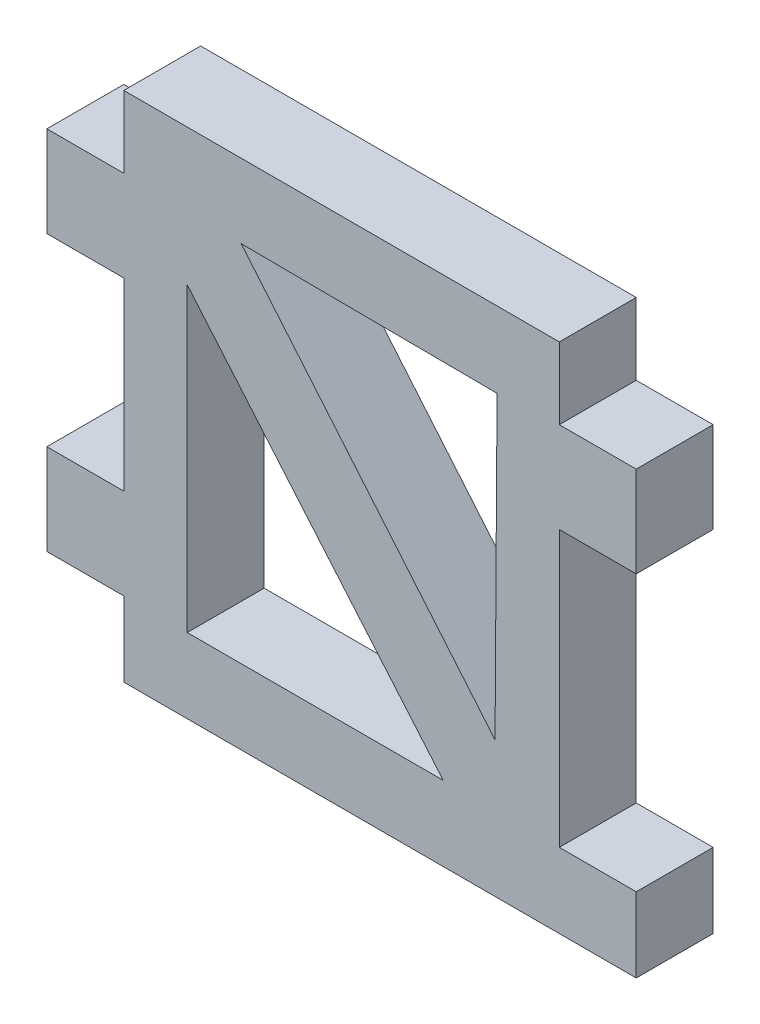
ISO-10303-21;
HEADER;
FILE_DESCRIPTION(('STEP AP214'),'2;1');
FILE_NAME('part.step','',(''),(''),'','','');
FILE_SCHEMA(('AUTOMOTIVE_DESIGN { 1 0 10303 214 1 1 1 1 }'));
ENDSEC;
DATA;
#1=APPLICATION_CONTEXT('core data for automotive mechanical design processes');
#2=APPLICATION_PROTOCOL_DEFINITION('international standard','automotive_design',2000,#1);
#3=PRODUCT_CONTEXT('',#1,'mechanical');
#4=PRODUCT('Part','Part','',(#3));
#5=PRODUCT_RELATED_PRODUCT_CATEGORY('part','',(#4));
#6=PRODUCT_DEFINITION_FORMATION('','',#4);
#7=PRODUCT_DEFINITION_CONTEXT('part definition',#1,'design');
#8=PRODUCT_DEFINITION('design','',#6,#7);
#9=PRODUCT_DEFINITION_SHAPE('','',#8);
#10=(LENGTH_UNIT() NAMED_UNIT(*) SI_UNIT(.MILLI.,.METRE.));
#11=(NAMED_UNIT(*) PLANE_ANGLE_UNIT() SI_UNIT($,.RADIAN.));
#12=(NAMED_UNIT(*) SI_UNIT($,.STERADIAN.) SOLID_ANGLE_UNIT());
#13=UNCERTAINTY_MEASURE_WITH_UNIT(LENGTH_MEASURE(1.E-05),#10,'distance_accuracy_value','');
#14=(GEOMETRIC_REPRESENTATION_CONTEXT(3) GLOBAL_UNCERTAINTY_ASSIGNED_CONTEXT((#13)) GLOBAL_UNIT_ASSIGNED_CONTEXT((#10,
#11,#12)) REPRESENTATION_CONTEXT('',''));
#15=CARTESIAN_POINT('',(0.,0.,0.));
#16=DIRECTION('',(0.,0.,1.));
#17=DIRECTION('',(1.,0.,0.));
#18=AXIS2_PLACEMENT_3D('',#15,#16,#17);
#19=CARTESIAN_POINT('',(0.,0.,10.));
#20=DIRECTION('',(0.,0.,1.));
#21=DIRECTION('',(1.,0.,0.));
#22=AXIS2_PLACEMENT_3D('',#19,#20,#21);
#23=PLANE('',#22);
#24=DIRECTION('',(0.,-1.,0.));
#25=VECTOR('',#24,1.);
#26=CARTESIAN_POINT('',(-28.32,23.992,10.));
#27=LINE('',#26,#25);
#28=CARTESIAN_POINT('',(-28.32,33.32,10.));
#29=VERTEX_POINT('',#28);
#30=CARTESIAN_POINT('',(-28.32,23.992,10.));
#31=VERTEX_POINT('',#30);
#32=EDGE_CURVE('E253',#29,#31,#27,.T.);
#33=ORIENTED_EDGE('',*,*,#32,.T.);
#34=DIRECTION('',(-1.,0.,0.));
#35=VECTOR('',#34,1.);
#36=CARTESIAN_POINT('',(-28.32,23.992,10.));
#37=LINE('',#36,#35);
#38=CARTESIAN_POINT('',(-38.32,23.992,10.));
#39=VERTEX_POINT('',#38);
#40=EDGE_CURVE('E256',#31,#39,#37,.T.);
#41=ORIENTED_EDGE('',*,*,#40,.T.);
#42=DIRECTION('',(0.,-1.,0.));
#43=VECTOR('',#42,1.);
#44=CARTESIAN_POINT('',(-38.32,23.992,10.));
#45=LINE('',#44,#43);
#46=CARTESIAN_POINT('',(-38.32,12.192,10.));
#47=VERTEX_POINT('',#46);
#48=EDGE_CURVE('E259',#39,#47,#45,.T.);
#49=ORIENTED_EDGE('',*,*,#48,.T.);
#50=DIRECTION('',(1.,0.,0.));
#51=VECTOR('',#50,1.);
#52=CARTESIAN_POINT('',(-38.32,12.192,10.));
#53=LINE('',#52,#51);
#54=CARTESIAN_POINT('',(-28.32,12.192,10.));
#55=VERTEX_POINT('',#54);
#56=EDGE_CURVE('E261',#47,#55,#53,.T.);
#57=ORIENTED_EDGE('',*,*,#56,.T.);
#58=DIRECTION('',(0.,-1.,0.));
#59=VECTOR('',#58,1.);
#60=CARTESIAN_POINT('',(-28.32,-11.808,10.));
#61=LINE('',#60,#59);
#62=CARTESIAN_POINT('',(-28.32,-11.808,10.));
#63=VERTEX_POINT('',#62);
#64=EDGE_CURVE('E263',#55,#63,#61,.T.);
#65=ORIENTED_EDGE('',*,*,#64,.T.);
#66=DIRECTION('',(-1.,0.,0.));
#67=VECTOR('',#66,1.);
#68=CARTESIAN_POINT('',(-28.32,-11.808,10.));
#69=LINE('',#68,#67);
#70=CARTESIAN_POINT('',(-38.32,-11.808,10.));
#71=VERTEX_POINT('',#70);
#72=EDGE_CURVE('E265',#63,#71,#69,.T.);
#73=ORIENTED_EDGE('',*,*,#72,.T.);
#74=DIRECTION('',(0.,-1.,0.));
#75=VECTOR('',#74,1.);
#76=CARTESIAN_POINT('',(-38.32,-11.808,10.));
#77=LINE('',#76,#75);
#78=CARTESIAN_POINT('',(-38.32,-23.608,10.));
#79=VERTEX_POINT('',#78);
#80=EDGE_CURVE('E267',#71,#79,#77,.T.);
#81=ORIENTED_EDGE('',*,*,#80,.T.);
#82=DIRECTION('',(1.,0.,0.));
#83=VECTOR('',#82,1.);
#84=CARTESIAN_POINT('',(-38.32,-23.608,10.));
#85=LINE('',#84,#83);
#86=CARTESIAN_POINT('',(-28.32,-23.608,10.));
#87=VERTEX_POINT('',#86);
#88=EDGE_CURVE('E269',#79,#87,#85,.T.);
#89=ORIENTED_EDGE('',*,*,#88,.T.);
#90=DIRECTION('',(0.,-1.,0.));
#91=VECTOR('',#90,1.);
#92=CARTESIAN_POINT('',(-28.32,-33.32,10.));
#93=LINE('',#92,#91);
#94=CARTESIAN_POINT('',(-28.32,-33.32,10.));
#95=VERTEX_POINT('',#94);
#96=EDGE_CURVE('E271',#87,#95,#93,.T.);
#97=ORIENTED_EDGE('',*,*,#96,.T.);
#98=DIRECTION('',(1.,0.,0.));
#99=VECTOR('',#98,1.);
#100=CARTESIAN_POINT('',(28.32,-33.32,10.));
#101=LINE('',#100,#99);
#102=CARTESIAN_POINT('',(38.32,-33.32,10.));
#103=VERTEX_POINT('',#102);
#104=EDGE_CURVE('E273',#95,#103,#101,.T.);
#105=ORIENTED_EDGE('',*,*,#104,.T.);
#106=DIRECTION('',(0.,1.,0.));
#107=VECTOR('',#106,1.);
#108=CARTESIAN_POINT('',(38.32,-33.32,10.));
#109=LINE('',#108,#107);
#110=CARTESIAN_POINT('',(38.32,-23.608,10.));
#111=VERTEX_POINT('',#110);
#112=EDGE_CURVE('E275',#103,#111,#109,.T.);
#113=ORIENTED_EDGE('',*,*,#112,.T.);
#114=DIRECTION('',(-1.,0.,0.));
#115=VECTOR('',#114,1.);
#116=CARTESIAN_POINT('',(38.32,-23.608,10.));
#117=LINE('',#116,#115);
#118=CARTESIAN_POINT('',(28.32,-23.608,10.));
#119=VERTEX_POINT('',#118);
#120=EDGE_CURVE('E277',#111,#119,#117,.T.);
#121=ORIENTED_EDGE('',*,*,#120,.T.);
#122=DIRECTION('',(0.,1.,0.));
#123=VECTOR('',#122,1.);
#124=CARTESIAN_POINT('',(28.32,-23.608,10.));
#125=LINE('',#124,#123);
#126=CARTESIAN_POINT('',(28.32,12.192,10.));
#127=VERTEX_POINT('',#126);
#128=EDGE_CURVE('E279',#119,#127,#125,.T.);
#129=ORIENTED_EDGE('',*,*,#128,.T.);
#130=DIRECTION('',(1.,0.,0.));
#131=VECTOR('',#130,1.);
#132=CARTESIAN_POINT('',(28.32,12.192,10.));
#133=LINE('',#132,#131);
#134=CARTESIAN_POINT('',(38.32,12.192,10.));
#135=VERTEX_POINT('',#134);
#136=EDGE_CURVE('E281',#127,#135,#133,.T.);
#137=ORIENTED_EDGE('',*,*,#136,.T.);
#138=DIRECTION('',(0.,1.,0.));
#139=VECTOR('',#138,1.);
#140=CARTESIAN_POINT('',(38.32,12.192,10.));
#141=LINE('',#140,#139);
#142=CARTESIAN_POINT('',(38.32,23.992,10.));
#143=VERTEX_POINT('',#142);
#144=EDGE_CURVE('E283',#135,#143,#141,.T.);
#145=ORIENTED_EDGE('',*,*,#144,.T.);
#146=DIRECTION('',(-1.,0.,0.));
#147=VECTOR('',#146,1.);
#148=CARTESIAN_POINT('',(38.32,23.992,10.));
#149=LINE('',#148,#147);
#150=CARTESIAN_POINT('',(28.32,23.992,10.));
#151=VERTEX_POINT('',#150);
#152=EDGE_CURVE('E285',#143,#151,#149,.T.);
#153=ORIENTED_EDGE('',*,*,#152,.T.);
#154=DIRECTION('',(0.,1.,0.));
#155=VECTOR('',#154,1.);
#156=CARTESIAN_POINT('',(28.32,23.992,10.));
#157=LINE('',#156,#155);
#158=CARTESIAN_POINT('',(28.32,33.32,10.));
#159=VERTEX_POINT('',#158);
#160=EDGE_CURVE('E287',#151,#159,#157,.T.);
#161=ORIENTED_EDGE('',*,*,#160,.T.);
#162=DIRECTION('',(-1.,0.,0.));
#163=VECTOR('',#162,1.);
#164=CARTESIAN_POINT('',(28.32,33.32,10.));
#165=LINE('',#164,#163);
#166=EDGE_CURVE('E289',#159,#29,#165,.T.);
#167=ORIENTED_EDGE('',*,*,#166,.T.);
#168=EDGE_LOOP('',(#33,#41,#49,#57,#65,#73,#81,#89,#97,#105,#113,#121,#129,#137,#145,#153,#161,#167));
#169=FACE_BOUND('',#168,.T.);
#170=DIRECTION('',(-0.647621867593382,0.761961886589388,0.));
#171=VECTOR('',#170,1.);
#172=CARTESIAN_POINT('',(-20.0653829531813,15.54908888197,10.));
#173=LINE('',#172,#171);
#174=CARTESIAN_POINT('',(13.2157922310141,-23.608,10.));
#175=VERTEX_POINT('',#174);
#176=CARTESIAN_POINT('',(-20.0653829531813,15.54908888197,10.));
#177=VERTEX_POINT('',#176);
#178=EDGE_CURVE('E231',#175,#177,#173,.T.);
#179=ORIENTED_EDGE('',*,*,#178,.F.);
#180=DIRECTION('',(1.,0.,0.));
#181=VECTOR('',#180,1.);
#182=CARTESIAN_POINT('',(13.2157922310141,-23.608,10.));
#183=LINE('',#182,#181);
#184=CARTESIAN_POINT('',(-20.0653829531813,-23.608,10.));
#185=VERTEX_POINT('',#184);
#186=EDGE_CURVE('E229',#185,#175,#183,.T.);
#187=ORIENTED_EDGE('',*,*,#186,.F.);
#188=DIRECTION('',(0.,-1.,0.));
#189=VECTOR('',#188,1.);
#190=CARTESIAN_POINT('',(-20.0653829531813,-23.608,10.));
#191=LINE('',#190,#189);
#192=EDGE_CURVE('E235',#177,#185,#191,.T.);
#193=ORIENTED_EDGE('',*,*,#192,.F.);
#194=EDGE_LOOP('',(#179,#187,#193));
#195=FACE_BOUND('',#194,.T.);
#196=DIRECTION('',(0.642544730945267,-0.76624817698607,0.));
#197=VECTOR('',#196,1.);
#198=CARTESIAN_POINT('',(19.9616244035888,-15.6820696748628,10.));
#199=LINE('',#198,#197);
#200=CARTESIAN_POINT('',(-13.0586376109387,23.6952909254054,10.));
#201=VERTEX_POINT('',#200);
#202=CARTESIAN_POINT('',(19.9616244035888,-15.6820696748628,10.));
#203=VERTEX_POINT('',#202);
#204=EDGE_CURVE('E210',#201,#203,#199,.T.);
#205=ORIENTED_EDGE('',*,*,#204,.F.);
#206=DIRECTION('',(-0.999977925199046,0.00664448001061593,0.));
#207=VECTOR('',#206,1.);
#208=CARTESIAN_POINT('',(-13.0586376109387,23.6952909254054,10.));
#209=LINE('',#208,#207);
#210=CARTESIAN_POINT('',(20.221802897939,23.4741548221642,10.));
#211=VERTEX_POINT('',#210);
#212=EDGE_CURVE('E202',#211,#201,#209,.T.);
#213=ORIENTED_EDGE('',*,*,#212,.F.);
#214=DIRECTION('',(0.00664448001061655,0.999977925199046,0.));
#215=VECTOR('',#214,1.);
#216=CARTESIAN_POINT('',(20.221802897939,23.4741548221642,10.));
#217=LINE('',#216,#215);
#218=EDGE_CURVE('E219',#203,#211,#217,.T.);
#219=ORIENTED_EDGE('',*,*,#218,.F.);
#220=EDGE_LOOP('',(#205,#213,#219));
#221=FACE_BOUND('',#220,.T.);
#222=ADVANCED_FACE('F41',(#169,#195,#221),#23,.T.);
#223=CARTESIAN_POINT('',(0.,0.,0.));
#224=DIRECTION('',(0.,0.,1.));
#225=DIRECTION('',(1.,0.,0.));
#226=AXIS2_PLACEMENT_3D('',#223,#224,#225);
#227=PLANE('',#226);
#228=DIRECTION('',(1.,0.,0.));
#229=VECTOR('',#228,1.);
#230=CARTESIAN_POINT('',(13.2157922310141,-23.608,0.));
#231=LINE('',#230,#229);
#232=CARTESIAN_POINT('',(-20.0653829531813,-23.608,0.));
#233=VERTEX_POINT('',#232);
#234=CARTESIAN_POINT('',(13.2157922310141,-23.608,0.));
#235=VERTEX_POINT('',#234);
#236=EDGE_CURVE('E217',#233,#235,#231,.T.);
#237=ORIENTED_EDGE('',*,*,#236,.T.);
#238=DIRECTION('',(-0.647621867593382,0.761961886589388,0.));
#239=VECTOR('',#238,1.);
#240=CARTESIAN_POINT('',(-20.0653829531813,15.54908888197,0.));
#241=LINE('',#240,#239);
#242=CARTESIAN_POINT('',(-20.0653829531813,15.54908888197,0.));
#243=VERTEX_POINT('',#242);
#244=EDGE_CURVE('E240',#235,#243,#241,.T.);
#245=ORIENTED_EDGE('',*,*,#244,.T.);
#246=DIRECTION('',(0.,-1.,0.));
#247=VECTOR('',#246,1.);
#248=CARTESIAN_POINT('',(-20.0653829531813,-23.608,0.));
#249=LINE('',#248,#247);
#250=EDGE_CURVE('E232',#243,#233,#249,.T.);
#251=ORIENTED_EDGE('',*,*,#250,.T.);
#252=EDGE_LOOP('',(#237,#245,#251));
#253=FACE_BOUND('',#252,.T.);
#254=DIRECTION('',(0.,-1.,0.));
#255=VECTOR('',#254,1.);
#256=CARTESIAN_POINT('',(-28.32,23.992,0.));
#257=LINE('',#256,#255);
#258=CARTESIAN_POINT('',(-28.32,33.32,0.));
#259=VERTEX_POINT('',#258);
#260=CARTESIAN_POINT('',(-28.32,23.992,0.));
#261=VERTEX_POINT('',#260);
#262=EDGE_CURVE('E252',#259,#261,#257,.T.);
#263=ORIENTED_EDGE('',*,*,#262,.F.);
#264=DIRECTION('',(-1.,0.,0.));
#265=VECTOR('',#264,1.);
#266=CARTESIAN_POINT('',(28.32,33.32,0.));
#267=LINE('',#266,#265);
#268=CARTESIAN_POINT('',(28.32,33.32,0.));
#269=VERTEX_POINT('',#268);
#270=EDGE_CURVE('E257',#269,#259,#267,.T.);
#271=ORIENTED_EDGE('',*,*,#270,.F.);
#272=DIRECTION('',(0.,1.,0.));
#273=VECTOR('',#272,1.);
#274=CARTESIAN_POINT('',(28.32,23.992,0.));
#275=LINE('',#274,#273);
#276=CARTESIAN_POINT('',(28.32,23.992,0.));
#277=VERTEX_POINT('',#276);
#278=EDGE_CURVE('E325',#277,#269,#275,.T.);
#279=ORIENTED_EDGE('',*,*,#278,.F.);
#280=DIRECTION('',(-1.,0.,0.));
#281=VECTOR('',#280,1.);
#282=CARTESIAN_POINT('',(38.32,23.992,0.));
#283=LINE('',#282,#281);
#284=CARTESIAN_POINT('',(38.32,23.992,0.));
#285=VERTEX_POINT('',#284);
#286=EDGE_CURVE('E323',#285,#277,#283,.T.);
#287=ORIENTED_EDGE('',*,*,#286,.F.);
#288=DIRECTION('',(0.,1.,0.));
#289=VECTOR('',#288,1.);
#290=CARTESIAN_POINT('',(38.32,12.192,0.));
#291=LINE('',#290,#289);
#292=CARTESIAN_POINT('',(38.32,12.192,0.));
#293=VERTEX_POINT('',#292);
#294=EDGE_CURVE('E321',#293,#285,#291,.T.);
#295=ORIENTED_EDGE('',*,*,#294,.F.);
#296=DIRECTION('',(1.,0.,0.));
#297=VECTOR('',#296,1.);
#298=CARTESIAN_POINT('',(28.32,12.192,0.));
#299=LINE('',#298,#297);
#300=CARTESIAN_POINT('',(28.32,12.192,0.));
#301=VERTEX_POINT('',#300);
#302=EDGE_CURVE('E319',#301,#293,#299,.T.);
#303=ORIENTED_EDGE('',*,*,#302,.F.);
#304=DIRECTION('',(0.,1.,0.));
#305=VECTOR('',#304,1.);
#306=CARTESIAN_POINT('',(28.32,-23.608,0.));
#307=LINE('',#306,#305);
#308=CARTESIAN_POINT('',(28.32,-23.608,0.));
#309=VERTEX_POINT('',#308);
#310=EDGE_CURVE('E317',#309,#301,#307,.T.);
#311=ORIENTED_EDGE('',*,*,#310,.F.);
#312=DIRECTION('',(-1.,0.,0.));
#313=VECTOR('',#312,1.);
#314=CARTESIAN_POINT('',(38.32,-23.608,0.));
#315=LINE('',#314,#313);
#316=CARTESIAN_POINT('',(38.32,-23.608,0.));
#317=VERTEX_POINT('',#316);
#318=EDGE_CURVE('E315',#317,#309,#315,.T.);
#319=ORIENTED_EDGE('',*,*,#318,.F.);
#320=DIRECTION('',(0.,1.,0.));
#321=VECTOR('',#320,1.);
#322=CARTESIAN_POINT('',(38.32,-33.32,0.));
#323=LINE('',#322,#321);
#324=CARTESIAN_POINT('',(38.32,-33.32,0.));
#325=VERTEX_POINT('',#324);
#326=EDGE_CURVE('E313',#325,#317,#323,.T.);
#327=ORIENTED_EDGE('',*,*,#326,.F.);
#328=DIRECTION('',(1.,0.,0.));
#329=VECTOR('',#328,1.);
#330=CARTESIAN_POINT('',(28.32,-33.32,0.));
#331=LINE('',#330,#329);
#332=CARTESIAN_POINT('',(-28.32,-33.32,0.));
#333=VERTEX_POINT('',#332);
#334=EDGE_CURVE('E311',#333,#325,#331,.T.);
#335=ORIENTED_EDGE('',*,*,#334,.F.);
#336=DIRECTION('',(0.,-1.,0.));
#337=VECTOR('',#336,1.);
#338=CARTESIAN_POINT('',(-28.32,-33.32,0.));
#339=LINE('',#338,#337);
#340=CARTESIAN_POINT('',(-28.32,-23.608,0.));
#341=VERTEX_POINT('',#340);
#342=EDGE_CURVE('E308',#341,#333,#339,.T.);
#343=ORIENTED_EDGE('',*,*,#342,.F.);
#344=DIRECTION('',(1.,0.,0.));
#345=VECTOR('',#344,1.);
#346=CARTESIAN_POINT('',(-38.32,-23.608,0.));
#347=LINE('',#346,#345);
#348=CARTESIAN_POINT('',(-38.32,-23.608,0.));
#349=VERTEX_POINT('',#348);
#350=EDGE_CURVE('E306',#349,#341,#347,.T.);
#351=ORIENTED_EDGE('',*,*,#350,.F.);
#352=DIRECTION('',(0.,-1.,0.));
#353=VECTOR('',#352,1.);
#354=CARTESIAN_POINT('',(-38.32,-11.808,0.));
#355=LINE('',#354,#353);
#356=CARTESIAN_POINT('',(-38.32,-11.808,0.));
#357=VERTEX_POINT('',#356);
#358=EDGE_CURVE('E304',#357,#349,#355,.T.);
#359=ORIENTED_EDGE('',*,*,#358,.F.);
#360=DIRECTION('',(-1.,0.,0.));
#361=VECTOR('',#360,1.);
#362=CARTESIAN_POINT('',(-28.32,-11.808,0.));
#363=LINE('',#362,#361);
#364=CARTESIAN_POINT('',(-28.32,-11.808,0.));
#365=VERTEX_POINT('',#364);
#366=EDGE_CURVE('E302',#365,#357,#363,.T.);
#367=ORIENTED_EDGE('',*,*,#366,.F.);
#368=DIRECTION('',(0.,-1.,0.));
#369=VECTOR('',#368,1.);
#370=CARTESIAN_POINT('',(-28.32,-11.808,0.));
#371=LINE('',#370,#369);
#372=CARTESIAN_POINT('',(-28.32,12.192,0.));
#373=VERTEX_POINT('',#372);
#374=EDGE_CURVE('E300',#373,#365,#371,.T.);
#375=ORIENTED_EDGE('',*,*,#374,.F.);
#376=DIRECTION('',(1.,0.,0.));
#377=VECTOR('',#376,1.);
#378=CARTESIAN_POINT('',(-38.32,12.192,0.));
#379=LINE('',#378,#377);
#380=CARTESIAN_POINT('',(-38.32,12.192,0.));
#381=VERTEX_POINT('',#380);
#382=EDGE_CURVE('E298',#381,#373,#379,.T.);
#383=ORIENTED_EDGE('',*,*,#382,.F.);
#384=DIRECTION('',(0.,-1.,0.));
#385=VECTOR('',#384,1.);
#386=CARTESIAN_POINT('',(-38.32,23.992,0.));
#387=LINE('',#386,#385);
#388=CARTESIAN_POINT('',(-38.32,23.992,0.));
#389=VERTEX_POINT('',#388);
#390=EDGE_CURVE('E296',#389,#381,#387,.T.);
#391=ORIENTED_EDGE('',*,*,#390,.F.);
#392=DIRECTION('',(-1.,0.,0.));
#393=VECTOR('',#392,1.);
#394=CARTESIAN_POINT('',(-28.32,23.992,0.));
#395=LINE('',#394,#393);
#396=EDGE_CURVE('E294',#261,#389,#395,.T.);
#397=ORIENTED_EDGE('',*,*,#396,.F.);
#398=EDGE_LOOP('',(#263,#271,#279,#287,#295,#303,#311,#319,#327,#335,#343,#351,#359,#367,#375,
#383,#391,#397));
#399=FACE_BOUND('',#398,.T.);
#400=DIRECTION('',(-0.999977925199046,0.00664448001061593,0.));
#401=VECTOR('',#400,1.);
#402=CARTESIAN_POINT('',(-13.0586376109387,23.6952909254054,0.));
#403=LINE('',#402,#401);
#404=CARTESIAN_POINT('',(20.221802897939,23.4741548221642,0.));
#405=VERTEX_POINT('',#404);
#406=CARTESIAN_POINT('',(-13.0586376109387,23.6952909254054,0.));
#407=VERTEX_POINT('',#406);
#408=EDGE_CURVE('E64',#405,#407,#403,.T.);
#409=ORIENTED_EDGE('',*,*,#408,.T.);
#410=DIRECTION('',(0.642544730945267,-0.76624817698607,0.));
#411=VECTOR('',#410,1.);
#412=CARTESIAN_POINT('',(19.9616244035888,-15.6820696748628,0.));
#413=LINE('',#412,#411);
#414=CARTESIAN_POINT('',(19.9616244035888,-15.6820696748628,0.));
#415=VERTEX_POINT('',#414);
#416=EDGE_CURVE('E216',#407,#415,#413,.T.);
#417=ORIENTED_EDGE('',*,*,#416,.T.);
#418=DIRECTION('',(0.00664448001061655,0.999977925199046,0.));
#419=VECTOR('',#418,1.);
#420=CARTESIAN_POINT('',(20.221802897939,23.4741548221642,0.));
#421=LINE('',#420,#419);
#422=EDGE_CURVE('E211',#415,#405,#421,.T.);
#423=ORIENTED_EDGE('',*,*,#422,.T.);
#424=EDGE_LOOP('',(#409,#417,#423));
#425=FACE_BOUND('',#424,.T.);
#426=ADVANCED_FACE('F385',(#253,#399,#425),#227,.F.);
#427=CARTESIAN_POINT('',(-28.32,23.992,10.));
#428=DIRECTION('',(1.,0.,0.));
#429=DIRECTION('',(0.,0.,-1.));
#430=AXIS2_PLACEMENT_3D('',#427,#428,#429);
#431=PLANE('',#430);
#432=ORIENTED_EDGE('',*,*,#262,.T.);
#433=DIRECTION('',(0.,0.,-1.));
#434=VECTOR('',#433,1.);
#435=CARTESIAN_POINT('',(-28.32,23.992,10.));
#436=LINE('',#435,#434);
#437=EDGE_CURVE('E11',#31,#261,#436,.T.);
#438=ORIENTED_EDGE('',*,*,#437,.F.);
#439=ORIENTED_EDGE('',*,*,#32,.F.);
#440=DIRECTION('',(0.,0.,-1.));
#441=VECTOR('',#440,1.);
#442=CARTESIAN_POINT('',(-28.32,33.32,10.));
#443=LINE('',#442,#441);
#444=EDGE_CURVE('E291',#29,#259,#443,.T.);
#445=ORIENTED_EDGE('',*,*,#444,.T.);
#446=EDGE_LOOP('',(#432,#438,#439,#445));
#447=FACE_BOUND('',#446,.T.);
#448=ADVANCED_FACE('F43',(#447),#431,.F.);
#449=CARTESIAN_POINT('',(-28.32,23.992,10.));
#450=DIRECTION('',(0.,-1.,0.));
#451=DIRECTION('',(0.,0.,-1.));
#452=AXIS2_PLACEMENT_3D('',#449,#450,#451);
#453=PLANE('',#452);
#454=ORIENTED_EDGE('',*,*,#396,.T.);
#455=DIRECTION('',(0.,0.,-1.));
#456=VECTOR('',#455,1.);
#457=CARTESIAN_POINT('',(-38.32,23.992,10.));
#458=LINE('',#457,#456);
#459=EDGE_CURVE('E49',#39,#389,#458,.T.);
#460=ORIENTED_EDGE('',*,*,#459,.F.);
#461=ORIENTED_EDGE('',*,*,#40,.F.);
#462=ORIENTED_EDGE('',*,*,#437,.T.);
#463=EDGE_LOOP('',(#454,#460,#461,#462));
#464=FACE_BOUND('',#463,.T.);
#465=ADVANCED_FACE('F403',(#464),#453,.F.);
#466=CARTESIAN_POINT('',(-38.32,23.992,10.));
#467=DIRECTION('',(1.,0.,0.));
#468=DIRECTION('',(0.,1.,0.));
#469=AXIS2_PLACEMENT_3D('',#466,#467,#468);
#470=PLANE('',#469);
#471=ORIENTED_EDGE('',*,*,#390,.T.);
#472=DIRECTION('',(0.,0.,-1.));
#473=VECTOR('',#472,1.);
#474=CARTESIAN_POINT('',(-38.32,12.192,10.));
#475=LINE('',#474,#473);
#476=EDGE_CURVE('E372',#47,#381,#475,.T.);
#477=ORIENTED_EDGE('',*,*,#476,.F.);
#478=ORIENTED_EDGE('',*,*,#48,.F.);
#479=ORIENTED_EDGE('',*,*,#459,.T.);
#480=EDGE_LOOP('',(#471,#477,#478,#479));
#481=FACE_BOUND('',#480,.T.);
#482=ADVANCED_FACE('F379',(#481),#470,.F.);
#483=CARTESIAN_POINT('',(-38.32,12.192,10.));
#484=DIRECTION('',(0.,1.,0.));
#485=DIRECTION('',(-1.,0.,0.));
#486=AXIS2_PLACEMENT_3D('',#483,#484,#485);
#487=PLANE('',#486);
#488=ORIENTED_EDGE('',*,*,#382,.T.);
#489=DIRECTION('',(0.,0.,-1.));
#490=VECTOR('',#489,1.);
#491=CARTESIAN_POINT('',(-28.32,12.192,10.));
#492=LINE('',#491,#490);
#493=EDGE_CURVE('E369',#55,#373,#492,.T.);
#494=ORIENTED_EDGE('',*,*,#493,.F.);
#495=ORIENTED_EDGE('',*,*,#56,.F.);
#496=ORIENTED_EDGE('',*,*,#476,.T.);
#497=EDGE_LOOP('',(#488,#494,#495,#496));
#498=FACE_BOUND('',#497,.T.);
#499=ADVANCED_FACE('F391',(#498),#487,.F.);
#500=CARTESIAN_POINT('',(-28.32,-11.808,10.));
#501=DIRECTION('',(1.,0.,0.));
#502=DIRECTION('',(0.,1.,0.));
#503=AXIS2_PLACEMENT_3D('',#500,#501,#502);
#504=PLANE('',#503);
#505=ORIENTED_EDGE('',*,*,#374,.T.);
#506=DIRECTION('',(0.,0.,-1.));
#507=VECTOR('',#506,1.);
#508=CARTESIAN_POINT('',(-28.32,-11.808,10.));
#509=LINE('',#508,#507);
#510=EDGE_CURVE('E366',#63,#365,#509,.T.);
#511=ORIENTED_EDGE('',*,*,#510,.F.);
#512=ORIENTED_EDGE('',*,*,#64,.F.);
#513=ORIENTED_EDGE('',*,*,#493,.T.);
#514=EDGE_LOOP('',(#505,#511,#512,#513));
#515=FACE_BOUND('',#514,.T.);
#516=ADVANCED_FACE('F395',(#515),#504,.F.);
#517=CARTESIAN_POINT('',(-28.32,-11.808,10.));
#518=DIRECTION('',(0.,-1.,0.));
#519=DIRECTION('',(0.,0.,-1.));
#520=AXIS2_PLACEMENT_3D('',#517,#518,#519);
#521=PLANE('',#520);
#522=ORIENTED_EDGE('',*,*,#366,.T.);
#523=DIRECTION('',(0.,0.,-1.));
#524=VECTOR('',#523,1.);
#525=CARTESIAN_POINT('',(-38.32,-11.808,10.));
#526=LINE('',#525,#524);
#527=EDGE_CURVE('E363',#71,#357,#526,.T.);
#528=ORIENTED_EDGE('',*,*,#527,.F.);
#529=ORIENTED_EDGE('',*,*,#72,.F.);
#530=ORIENTED_EDGE('',*,*,#510,.T.);
#531=EDGE_LOOP('',(#522,#528,#529,#530));
#532=FACE_BOUND('',#531,.T.);
#533=ADVANCED_FACE('F465',(#532),#521,.F.);
#534=CARTESIAN_POINT('',(-38.32,-11.808,10.));
#535=DIRECTION('',(1.,0.,0.));
#536=DIRECTION('',(0.,1.,0.));
#537=AXIS2_PLACEMENT_3D('',#534,#535,#536);
#538=PLANE('',#537);
#539=ORIENTED_EDGE('',*,*,#358,.T.);
#540=DIRECTION('',(0.,0.,-1.));
#541=VECTOR('',#540,1.);
#542=CARTESIAN_POINT('',(-38.32,-23.608,10.));
#543=LINE('',#542,#541);
#544=EDGE_CURVE('E360',#79,#349,#543,.T.);
#545=ORIENTED_EDGE('',*,*,#544,.F.);
#546=ORIENTED_EDGE('',*,*,#80,.F.);
#547=ORIENTED_EDGE('',*,*,#527,.T.);
#548=EDGE_LOOP('',(#539,#545,#546,#547));
#549=FACE_BOUND('',#548,.T.);
#550=ADVANCED_FACE('F462',(#549),#538,.F.);
#551=CARTESIAN_POINT('',(-38.32,-23.608,10.));
#552=DIRECTION('',(0.,1.,0.));
#553=DIRECTION('',(0.,0.,1.));
#554=AXIS2_PLACEMENT_3D('',#551,#552,#553);
#555=PLANE('',#554);
#556=ORIENTED_EDGE('',*,*,#350,.T.);
#557=DIRECTION('',(0.,0.,-1.));
#558=VECTOR('',#557,1.);
#559=CARTESIAN_POINT('',(-28.32,-23.608,10.));
#560=LINE('',#559,#558);
#561=EDGE_CURVE('E357',#87,#341,#560,.T.);
#562=ORIENTED_EDGE('',*,*,#561,.F.);
#563=ORIENTED_EDGE('',*,*,#88,.F.);
#564=ORIENTED_EDGE('',*,*,#544,.T.);
#565=EDGE_LOOP('',(#556,#562,#563,#564));
#566=FACE_BOUND('',#565,.T.);
#567=ADVANCED_FACE('F458',(#566),#555,.F.);
#568=CARTESIAN_POINT('',(-28.32,-33.32,10.));
#569=DIRECTION('',(1.,0.,0.));
#570=DIRECTION('',(0.,0.,-1.));
#571=AXIS2_PLACEMENT_3D('',#568,#569,#570);
#572=PLANE('',#571);
#573=ORIENTED_EDGE('',*,*,#342,.T.);
#574=DIRECTION('',(0.,0.,-1.));
#575=VECTOR('',#574,1.);
#576=CARTESIAN_POINT('',(-28.32,-33.32,10.));
#577=LINE('',#576,#575);
#578=EDGE_CURVE('E354',#95,#333,#577,.T.);
#579=ORIENTED_EDGE('',*,*,#578,.F.);
#580=ORIENTED_EDGE('',*,*,#96,.F.);
#581=ORIENTED_EDGE('',*,*,#561,.T.);
#582=EDGE_LOOP('',(#573,#579,#580,#581));
#583=FACE_BOUND('',#582,.T.);
#584=ADVANCED_FACE('F453',(#583),#572,.F.);
#585=CARTESIAN_POINT('',(28.32,-33.32,10.));
#586=DIRECTION('',(0.,1.,0.));
#587=DIRECTION('',(-1.,0.,0.));
#588=AXIS2_PLACEMENT_3D('',#585,#586,#587);
#589=PLANE('',#588);
#590=ORIENTED_EDGE('',*,*,#334,.T.);
#591=DIRECTION('',(0.,0.,-1.));
#592=VECTOR('',#591,1.);
#593=CARTESIAN_POINT('',(38.32,-33.32,10.));
#594=LINE('',#593,#592);
#595=EDGE_CURVE('E351',#103,#325,#594,.T.);
#596=ORIENTED_EDGE('',*,*,#595,.F.);
#597=ORIENTED_EDGE('',*,*,#104,.F.);
#598=ORIENTED_EDGE('',*,*,#578,.T.);
#599=EDGE_LOOP('',(#590,#596,#597,#598));
#600=FACE_BOUND('',#599,.T.);
#601=ADVANCED_FACE('F448',(#600),#589,.F.);
#602=CARTESIAN_POINT('',(38.32,-33.32,10.));
#603=DIRECTION('',(-1.,0.,0.));
#604=DIRECTION('',(0.,0.,1.));
#605=AXIS2_PLACEMENT_3D('',#602,#603,#604);
#606=PLANE('',#605);
#607=ORIENTED_EDGE('',*,*,#326,.T.);
#608=DIRECTION('',(0.,0.,-1.));
#609=VECTOR('',#608,1.);
#610=CARTESIAN_POINT('',(38.32,-23.608,10.));
#611=LINE('',#610,#609);
#612=EDGE_CURVE('E348',#111,#317,#611,.T.);
#613=ORIENTED_EDGE('',*,*,#612,.F.);
#614=ORIENTED_EDGE('',*,*,#112,.F.);
#615=ORIENTED_EDGE('',*,*,#595,.T.);
#616=EDGE_LOOP('',(#607,#613,#614,#615));
#617=FACE_BOUND('',#616,.T.);
#618=ADVANCED_FACE('F444',(#617),#606,.F.);
#619=CARTESIAN_POINT('',(38.32,-23.608,10.));
#620=DIRECTION('',(0.,-1.,0.));
#621=DIRECTION('',(1.,0.,0.));
#622=AXIS2_PLACEMENT_3D('',#619,#620,#621);
#623=PLANE('',#622);
#624=ORIENTED_EDGE('',*,*,#318,.T.);
#625=DIRECTION('',(0.,0.,-1.));
#626=VECTOR('',#625,1.);
#627=CARTESIAN_POINT('',(28.32,-23.608,10.));
#628=LINE('',#627,#626);
#629=EDGE_CURVE('E345',#119,#309,#628,.T.);
#630=ORIENTED_EDGE('',*,*,#629,.F.);
#631=ORIENTED_EDGE('',*,*,#120,.F.);
#632=ORIENTED_EDGE('',*,*,#612,.T.);
#633=EDGE_LOOP('',(#624,#630,#631,#632));
#634=FACE_BOUND('',#633,.T.);
#635=ADVANCED_FACE('F439',(#634),#623,.F.);
#636=CARTESIAN_POINT('',(28.32,-23.608,10.));
#637=DIRECTION('',(-1.,0.,0.));
#638=DIRECTION('',(0.,0.,1.));
#639=AXIS2_PLACEMENT_3D('',#636,#637,#638);
#640=PLANE('',#639);
#641=ORIENTED_EDGE('',*,*,#310,.T.);
#642=DIRECTION('',(0.,0.,-1.));
#643=VECTOR('',#642,1.);
#644=CARTESIAN_POINT('',(28.32,12.192,10.));
#645=LINE('',#644,#643);
#646=EDGE_CURVE('E342',#127,#301,#645,.T.);
#647=ORIENTED_EDGE('',*,*,#646,.F.);
#648=ORIENTED_EDGE('',*,*,#128,.F.);
#649=ORIENTED_EDGE('',*,*,#629,.T.);
#650=EDGE_LOOP('',(#641,#647,#648,#649));
#651=FACE_BOUND('',#650,.T.);
#652=ADVANCED_FACE('F434',(#651),#640,.F.);
#653=CARTESIAN_POINT('',(28.32,12.192,10.));
#654=DIRECTION('',(0.,1.,0.));
#655=DIRECTION('',(0.,0.,1.));
#656=AXIS2_PLACEMENT_3D('',#653,#654,#655);
#657=PLANE('',#656);
#658=ORIENTED_EDGE('',*,*,#302,.T.);
#659=DIRECTION('',(0.,0.,-1.));
#660=VECTOR('',#659,1.);
#661=CARTESIAN_POINT('',(38.32,12.192,10.));
#662=LINE('',#661,#660);
#663=EDGE_CURVE('E339',#135,#293,#662,.T.);
#664=ORIENTED_EDGE('',*,*,#663,.F.);
#665=ORIENTED_EDGE('',*,*,#136,.F.);
#666=ORIENTED_EDGE('',*,*,#646,.T.);
#667=EDGE_LOOP('',(#658,#664,#665,#666));
#668=FACE_BOUND('',#667,.T.);
#669=ADVANCED_FACE('F430',(#668),#657,.F.);
#670=CARTESIAN_POINT('',(38.32,12.192,10.));
#671=DIRECTION('',(-1.,0.,0.));
#672=DIRECTION('',(0.,0.,1.));
#673=AXIS2_PLACEMENT_3D('',#670,#671,#672);
#674=PLANE('',#673);
#675=ORIENTED_EDGE('',*,*,#294,.T.);
#676=DIRECTION('',(0.,0.,-1.));
#677=VECTOR('',#676,1.);
#678=CARTESIAN_POINT('',(38.32,23.992,10.));
#679=LINE('',#678,#677);
#680=EDGE_CURVE('E336',#143,#285,#679,.T.);
#681=ORIENTED_EDGE('',*,*,#680,.F.);
#682=ORIENTED_EDGE('',*,*,#144,.F.);
#683=ORIENTED_EDGE('',*,*,#663,.T.);
#684=EDGE_LOOP('',(#675,#681,#682,#683));
#685=FACE_BOUND('',#684,.T.);
#686=ADVANCED_FACE('F425',(#685),#674,.F.);
#687=CARTESIAN_POINT('',(38.32,23.992,10.));
#688=DIRECTION('',(0.,-1.,0.));
#689=DIRECTION('',(0.,0.,-1.));
#690=AXIS2_PLACEMENT_3D('',#687,#688,#689);
#691=PLANE('',#690);
#692=ORIENTED_EDGE('',*,*,#286,.T.);
#693=DIRECTION('',(0.,0.,-1.));
#694=VECTOR('',#693,1.);
#695=CARTESIAN_POINT('',(28.32,23.992,10.));
#696=LINE('',#695,#694);
#697=EDGE_CURVE('E333',#151,#277,#696,.T.);
#698=ORIENTED_EDGE('',*,*,#697,.F.);
#699=ORIENTED_EDGE('',*,*,#152,.F.);
#700=ORIENTED_EDGE('',*,*,#680,.T.);
#701=EDGE_LOOP('',(#692,#698,#699,#700));
#702=FACE_BOUND('',#701,.T.);
#703=ADVANCED_FACE('F419',(#702),#691,.F.);
#704=CARTESIAN_POINT('',(28.32,23.992,10.));
#705=DIRECTION('',(-1.,0.,0.));
#706=DIRECTION('',(0.,-1.,0.));
#707=AXIS2_PLACEMENT_3D('',#704,#705,#706);
#708=PLANE('',#707);
#709=ORIENTED_EDGE('',*,*,#278,.T.);
#710=DIRECTION('',(0.,0.,-1.));
#711=VECTOR('',#710,1.);
#712=CARTESIAN_POINT('',(28.32,33.32,10.));
#713=LINE('',#712,#711);
#714=EDGE_CURVE('E330',#159,#269,#713,.T.);
#715=ORIENTED_EDGE('',*,*,#714,.F.);
#716=ORIENTED_EDGE('',*,*,#160,.F.);
#717=ORIENTED_EDGE('',*,*,#697,.T.);
#718=EDGE_LOOP('',(#709,#715,#716,#717));
#719=FACE_BOUND('',#718,.T.);
#720=ADVANCED_FACE('F415',(#719),#708,.F.);
#721=CARTESIAN_POINT('',(28.32,33.32,10.));
#722=DIRECTION('',(0.,-1.,0.));
#723=DIRECTION('',(0.,0.,-1.));
#724=AXIS2_PLACEMENT_3D('',#721,#722,#723);
#725=PLANE('',#724);
#726=ORIENTED_EDGE('',*,*,#270,.T.);
#727=ORIENTED_EDGE('',*,*,#444,.F.);
#728=ORIENTED_EDGE('',*,*,#166,.F.);
#729=ORIENTED_EDGE('',*,*,#714,.T.);
#730=EDGE_LOOP('',(#726,#727,#728,#729));
#731=FACE_BOUND('',#730,.T.);
#732=ADVANCED_FACE('F410',(#731),#725,.F.);
#733=CARTESIAN_POINT('',(13.2157922310141,-23.608,10.));
#734=DIRECTION('',(0.,1.,0.));
#735=DIRECTION('',(-1.,0.,0.));
#736=AXIS2_PLACEMENT_3D('',#733,#734,#735);
#737=PLANE('',#736);
#738=ORIENTED_EDGE('',*,*,#236,.F.);
#739=DIRECTION('',(0.,0.,-1.));
#740=VECTOR('',#739,1.);
#741=CARTESIAN_POINT('',(-20.0653829531813,-23.608,10.));
#742=LINE('',#741,#740);
#743=EDGE_CURVE('E237',#185,#233,#742,.T.);
#744=ORIENTED_EDGE('',*,*,#743,.F.);
#745=ORIENTED_EDGE('',*,*,#186,.T.);
#746=DIRECTION('',(0.,0.,-1.));
#747=VECTOR('',#746,1.);
#748=CARTESIAN_POINT('',(13.2157922310141,-23.608,10.));
#749=LINE('',#748,#747);
#750=EDGE_CURVE('E249',#175,#235,#749,.T.);
#751=ORIENTED_EDGE('',*,*,#750,.T.);
#752=EDGE_LOOP('',(#738,#744,#745,#751));
#753=FACE_BOUND('',#752,.T.);
#754=ADVANCED_FACE('F482',(#753),#737,.T.);
#755=CARTESIAN_POINT('',(-20.0653829531813,15.54908888197,10.));
#756=DIRECTION('',(-0.761961886589388,-0.647621867593382,0.));
#757=DIRECTION('',(0.647621867593382,-0.761961886589388,0.));
#758=AXIS2_PLACEMENT_3D('',#755,#756,#757);
#759=PLANE('',#758);
#760=ORIENTED_EDGE('',*,*,#244,.F.);
#761=ORIENTED_EDGE('',*,*,#750,.F.);
#762=ORIENTED_EDGE('',*,*,#178,.T.);
#763=DIRECTION('',(0.,0.,-1.));
#764=VECTOR('',#763,1.);
#765=CARTESIAN_POINT('',(-20.0653829531813,15.54908888197,10.));
#766=LINE('',#765,#764);
#767=EDGE_CURVE('E247',#177,#243,#766,.T.);
#768=ORIENTED_EDGE('',*,*,#767,.T.);
#769=EDGE_LOOP('',(#760,#761,#762,#768));
#770=FACE_BOUND('',#769,.T.);
#771=ADVANCED_FACE('F567',(#770),#759,.T.);
#772=CARTESIAN_POINT('',(-20.0653829531813,-23.608,10.));
#773=DIRECTION('',(1.,0.,0.));
#774=DIRECTION('',(0.,1.,0.));
#775=AXIS2_PLACEMENT_3D('',#772,#773,#774);
#776=PLANE('',#775);
#777=ORIENTED_EDGE('',*,*,#250,.F.);
#778=ORIENTED_EDGE('',*,*,#767,.F.);
#779=ORIENTED_EDGE('',*,*,#192,.T.);
#780=ORIENTED_EDGE('',*,*,#743,.T.);
#781=EDGE_LOOP('',(#777,#778,#779,#780));
#782=FACE_BOUND('',#781,.T.);
#783=ADVANCED_FACE('F575',(#782),#776,.T.);
#784=CARTESIAN_POINT('',(-13.0586376109387,23.6952909254054,10.));
#785=DIRECTION('',(-0.00664448001061593,-0.999977925199046,0.));
#786=DIRECTION('',(0.999977925199046,-0.00664448001061593,0.));
#787=AXIS2_PLACEMENT_3D('',#784,#785,#786);
#788=PLANE('',#787);
#789=ORIENTED_EDGE('',*,*,#408,.F.);
#790=DIRECTION('',(0.,0.,-1.));
#791=VECTOR('',#790,1.);
#792=CARTESIAN_POINT('',(20.221802897939,23.4741548221642,10.));
#793=LINE('',#792,#791);
#794=EDGE_CURVE('E206',#211,#405,#793,.T.);
#795=ORIENTED_EDGE('',*,*,#794,.F.);
#796=ORIENTED_EDGE('',*,*,#212,.T.);
#797=DIRECTION('',(0.,0.,-1.));
#798=VECTOR('',#797,1.);
#799=CARTESIAN_POINT('',(-13.0586376109387,23.6952909254054,10.));
#800=LINE('',#799,#798);
#801=EDGE_CURVE('E205',#201,#407,#800,.T.);
#802=ORIENTED_EDGE('',*,*,#801,.T.);
#803=EDGE_LOOP('',(#789,#795,#796,#802));
#804=FACE_BOUND('',#803,.T.);
#805=ADVANCED_FACE('F204',(#804),#788,.T.);
#806=CARTESIAN_POINT('',(19.9616244035888,-15.6820696748628,10.));
#807=DIRECTION('',(0.76624817698607,0.642544730945267,0.));
#808=DIRECTION('',(-0.642544730945267,0.76624817698607,0.));
#809=AXIS2_PLACEMENT_3D('',#806,#807,#808);
#810=PLANE('',#809);
#811=ORIENTED_EDGE('',*,*,#416,.F.);
#812=ORIENTED_EDGE('',*,*,#801,.F.);
#813=ORIENTED_EDGE('',*,*,#204,.T.);
#814=DIRECTION('',(0.,0.,-1.));
#815=VECTOR('',#814,1.);
#816=CARTESIAN_POINT('',(19.9616244035888,-15.6820696748628,10.));
#817=LINE('',#816,#815);
#818=EDGE_CURVE('E56',#203,#415,#817,.T.);
#819=ORIENTED_EDGE('',*,*,#818,.T.);
#820=EDGE_LOOP('',(#811,#812,#813,#819));
#821=FACE_BOUND('',#820,.T.);
#822=ADVANCED_FACE('F214',(#821),#810,.T.);
#823=CARTESIAN_POINT('',(20.221802897939,23.4741548221642,10.));
#824=DIRECTION('',(-0.999977925199046,0.00664448001061655,0.));
#825=DIRECTION('',(-0.00664448001061655,-0.999977925199046,0.));
#826=AXIS2_PLACEMENT_3D('',#823,#824,#825);
#827=PLANE('',#826);
#828=ORIENTED_EDGE('',*,*,#422,.F.);
#829=ORIENTED_EDGE('',*,*,#818,.F.);
#830=ORIENTED_EDGE('',*,*,#218,.T.);
#831=ORIENTED_EDGE('',*,*,#794,.T.);
#832=EDGE_LOOP('',(#828,#829,#830,#831));
#833=FACE_BOUND('',#832,.T.);
#834=ADVANCED_FACE('F598',(#833),#827,.T.);
#835=CLOSED_SHELL('',(#222,#426,#448,#465,#482,#499,#516,#533,#550,#567,#584,#601,#618,#635,
#652,#669,#686,#703,#720,#732,#754,#771,#783,#805,#822,#834));
#836=MANIFOLD_SOLID_BREP('B2',#835);
#837=ADVANCED_BREP_SHAPE_REPRESENTATION('',(#18,#836),#14);
#838=SHAPE_DEFINITION_REPRESENTATION(#9,#837);
ENDSEC;
END-ISO-10303-21;
